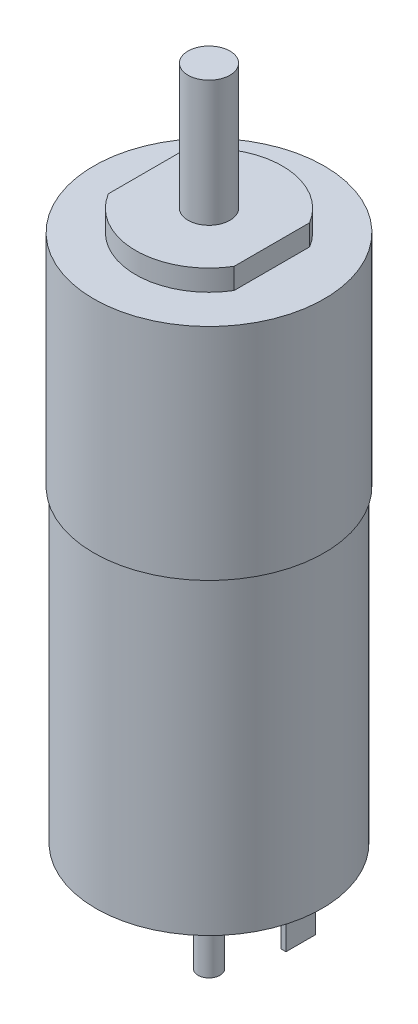
ISO-10303-21;
HEADER;
FILE_DESCRIPTION(('STEP AP214'),'2;1');
FILE_NAME('part.step','',(''),(''),'','','');
FILE_SCHEMA(('AUTOMOTIVE_DESIGN { 1 0 10303 214 1 1 1 1 }'));
ENDSEC;
DATA;
#1=APPLICATION_CONTEXT('core data for automotive mechanical design processes');
#2=APPLICATION_PROTOCOL_DEFINITION('international standard','automotive_design',2000,#1);
#3=PRODUCT_CONTEXT('',#1,'mechanical');
#4=PRODUCT('Part','Part','',(#3));
#5=PRODUCT_RELATED_PRODUCT_CATEGORY('part','',(#4));
#6=PRODUCT_DEFINITION_FORMATION('','',#4);
#7=PRODUCT_DEFINITION_CONTEXT('part definition',#1,'design');
#8=PRODUCT_DEFINITION('design','',#6,#7);
#9=PRODUCT_DEFINITION_SHAPE('','',#8);
#10=(LENGTH_UNIT() NAMED_UNIT(*) SI_UNIT(.MILLI.,.METRE.));
#11=(NAMED_UNIT(*) PLANE_ANGLE_UNIT() SI_UNIT($,.RADIAN.));
#12=(NAMED_UNIT(*) SI_UNIT($,.STERADIAN.) SOLID_ANGLE_UNIT());
#13=UNCERTAINTY_MEASURE_WITH_UNIT(LENGTH_MEASURE(1.E-05),#10,'distance_accuracy_value','');
#14=(GEOMETRIC_REPRESENTATION_CONTEXT(3) GLOBAL_UNCERTAINTY_ASSIGNED_CONTEXT((#13)) GLOBAL_UNIT_ASSIGNED_CONTEXT((#10,
#11,#12)) REPRESENTATION_CONTEXT('',''));
#15=CARTESIAN_POINT('',(0.,0.,0.));
#16=DIRECTION('',(0.,0.,1.));
#17=DIRECTION('',(1.,0.,0.));
#18=AXIS2_PLACEMENT_3D('',#15,#16,#17);
#19=CARTESIAN_POINT('',(0.,0.,0.));
#20=DIRECTION('',(0.,1.,0.));
#21=DIRECTION('',(0.,0.,1.));
#22=AXIS2_PLACEMENT_3D('',#19,#20,#21);
#23=PLANE('',#22);
#24=DIRECTION('',(0.,0.,-1.));
#25=VECTOR('',#24,1.);
#26=CARTESIAN_POINT('',(-8.75,0.,1.4));
#27=LINE('',#26,#25);
#28=CARTESIAN_POINT('',(-8.75,0.,1.4));
#29=VERTEX_POINT('',#28);
#30=CARTESIAN_POINT('',(-8.75,0.,-1.4));
#31=VERTEX_POINT('',#30);
#32=EDGE_CURVE('E155',#29,#31,#27,.T.);
#33=ORIENTED_EDGE('',*,*,#32,.F.);
#34=DIRECTION('',(-1.,0.,0.));
#35=VECTOR('',#34,1.);
#36=CARTESIAN_POINT('',(-8.75,0.,1.4));
#37=LINE('',#36,#35);
#38=CARTESIAN_POINT('',(-8.25,0.,1.4));
#39=VERTEX_POINT('',#38);
#40=EDGE_CURVE('E171',#39,#29,#37,.T.);
#41=ORIENTED_EDGE('',*,*,#40,.F.);
#42=DIRECTION('',(0.,0.,1.));
#43=VECTOR('',#42,1.);
#44=CARTESIAN_POINT('',(-8.25,0.,1.4));
#45=LINE('',#44,#43);
#46=CARTESIAN_POINT('',(-8.25,0.,-1.4));
#47=VERTEX_POINT('',#46);
#48=EDGE_CURVE('E184',#47,#39,#45,.T.);
#49=ORIENTED_EDGE('',*,*,#48,.F.);
#50=DIRECTION('',(1.,0.,0.));
#51=VECTOR('',#50,1.);
#52=CARTESIAN_POINT('',(-8.75,0.,-1.4));
#53=LINE('',#52,#51);
#54=EDGE_CURVE('E160',#31,#47,#53,.T.);
#55=ORIENTED_EDGE('',*,*,#54,.F.);
#56=EDGE_LOOP('',(#33,#41,#49,#55));
#57=FACE_BOUND('',#56,.T.);
#58=CARTESIAN_POINT('',(0.,0.,0.));
#59=DIRECTION('',(0.,-1.,0.));
#60=DIRECTION('',(0.,0.,-1.));
#61=AXIS2_PLACEMENT_3D('',#58,#59,#60);
#62=CIRCLE('',#61,3.75);
#63=CARTESIAN_POINT('',(0.,0.,-3.75));
#64=VERTEX_POINT('',#63);
#65=EDGE_CURVE('E49',#64,#64,#62,.T.);
#66=ORIENTED_EDGE('',*,*,#65,.F.);
#67=EDGE_LOOP('',(#66));
#68=FACE_BOUND('',#67,.T.);
#69=CARTESIAN_POINT('',(0.,0.,0.));
#70=DIRECTION('',(0.,1.,0.));
#71=DIRECTION('',(0.,0.,1.));
#72=AXIS2_PLACEMENT_3D('',#69,#70,#71);
#73=CIRCLE('',#72,10.8);
#74=CARTESIAN_POINT('',(0.,0.,10.8));
#75=VERTEX_POINT('',#74);
#76=EDGE_CURVE('E43',#75,#75,#73,.T.);
#77=ORIENTED_EDGE('',*,*,#76,.F.);
#78=EDGE_LOOP('',(#77));
#79=FACE_BOUND('',#78,.T.);
#80=DIRECTION('',(0.,0.,-1.));
#81=VECTOR('',#80,1.);
#82=CARTESIAN_POINT('',(8.25,0.,1.4));
#83=LINE('',#82,#81);
#84=CARTESIAN_POINT('',(8.25,0.,1.4));
#85=VERTEX_POINT('',#84);
#86=CARTESIAN_POINT('',(8.25,0.,-1.4));
#87=VERTEX_POINT('',#86);
#88=EDGE_CURVE('E153',#85,#87,#83,.T.);
#89=ORIENTED_EDGE('',*,*,#88,.F.);
#90=DIRECTION('',(-1.,0.,0.));
#91=VECTOR('',#90,1.);
#92=CARTESIAN_POINT('',(8.25,0.,1.4));
#93=LINE('',#92,#91);
#94=CARTESIAN_POINT('',(8.75,0.,1.4));
#95=VERTEX_POINT('',#94);
#96=EDGE_CURVE('E150',#95,#85,#93,.T.);
#97=ORIENTED_EDGE('',*,*,#96,.F.);
#98=DIRECTION('',(0.,0.,1.));
#99=VECTOR('',#98,1.);
#100=CARTESIAN_POINT('',(8.75,0.,1.4));
#101=LINE('',#100,#99);
#102=CARTESIAN_POINT('',(8.75,0.,-1.4));
#103=VERTEX_POINT('',#102);
#104=EDGE_CURVE('E62',#103,#95,#101,.T.);
#105=ORIENTED_EDGE('',*,*,#104,.F.);
#106=DIRECTION('',(1.,0.,0.));
#107=VECTOR('',#106,1.);
#108=CARTESIAN_POINT('',(8.25,0.,-1.4));
#109=LINE('',#108,#107);
#110=EDGE_CURVE('E57',#87,#103,#109,.T.);
#111=ORIENTED_EDGE('',*,*,#110,.F.);
#112=EDGE_LOOP('',(#89,#97,#105,#111));
#113=FACE_BOUND('',#112,.T.);
#114=ADVANCED_FACE('F39',(#57,#68,#79,#113),#23,.F.);
#115=CARTESIAN_POINT('',(0.,29.5,0.));
#116=DIRECTION('',(0.,-1.,0.));
#117=DIRECTION('',(0.,0.,-1.));
#118=AXIS2_PLACEMENT_3D('',#115,#116,#117);
#119=CYLINDRICAL_SURFACE('',#118,10.8);
#120=CARTESIAN_POINT('',(0.,29.5,0.));
#121=DIRECTION('',(0.,1.,0.));
#122=DIRECTION('',(0.,0.,1.));
#123=AXIS2_PLACEMENT_3D('',#120,#121,#122);
#124=CIRCLE('',#123,10.8);
#125=CARTESIAN_POINT('',(0.,29.5,10.8));
#126=VERTEX_POINT('',#125);
#127=EDGE_CURVE('E222',#126,#126,#124,.T.);
#128=ORIENTED_EDGE('',*,*,#127,.F.);
#129=EDGE_LOOP('',(#128));
#130=FACE_BOUND('',#129,.T.);
#131=ORIENTED_EDGE('',*,*,#76,.T.);
#132=EDGE_LOOP('',(#131));
#133=FACE_BOUND('',#132,.T.);
#134=ADVANCED_FACE('F41',(#130,#133),#119,.T.);
#135=CARTESIAN_POINT('',(0.,50.5,0.));
#136=DIRECTION('',(0.,-1.,0.));
#137=DIRECTION('',(0.,0.,-1.));
#138=AXIS2_PLACEMENT_3D('',#135,#136,#137);
#139=CYLINDRICAL_SURFACE('',#138,11.);
#140=CARTESIAN_POINT('',(0.,50.5,0.));
#141=DIRECTION('',(0.,1.,0.));
#142=DIRECTION('',(0.,0.,1.));
#143=AXIS2_PLACEMENT_3D('',#140,#141,#142);
#144=CIRCLE('',#143,11.);
#145=CARTESIAN_POINT('',(0.,50.5,-11.));
#146=VERTEX_POINT('',#145);
#147=EDGE_CURVE('E268',#146,#146,#144,.T.);
#148=CARTESIAN_POINT('',(0.,29.5,0.));
#149=DIRECTION('',(0.,1.,0.));
#150=DIRECTION('',(0.,0.,1.));
#151=AXIS2_PLACEMENT_3D('',#148,#149,#150);
#152=CIRCLE('',#151,11.);
#153=CARTESIAN_POINT('',(0.,29.5,-11.));
#154=VERTEX_POINT('',#153);
#155=EDGE_CURVE('E267',#154,#154,#152,.T.);
#156=CARTESIAN_POINT('',(0.,50.5,-11.));
#157=CARTESIAN_POINT('',(0.,50.28125,-11.));
#158=CARTESIAN_POINT('',(0.,50.0625,-11.));
#159=CARTESIAN_POINT('',(0.,49.625,-11.));
#160=CARTESIAN_POINT('',(0.,49.40625,-11.));
#161=CARTESIAN_POINT('',(0.,48.96875,-11.));
#162=CARTESIAN_POINT('',(0.,48.75,-11.));
#163=CARTESIAN_POINT('',(0.,48.3125,-11.));
#164=CARTESIAN_POINT('',(0.,48.09375,-11.));
#165=CARTESIAN_POINT('',(0.,47.65625,-11.));
#166=CARTESIAN_POINT('',(0.,47.4375,-11.));
#167=CARTESIAN_POINT('',(0.,47.,-11.));
#168=CARTESIAN_POINT('',(0.,46.78125,-11.));
#169=CARTESIAN_POINT('',(0.,46.34375,-11.));
#170=CARTESIAN_POINT('',(0.,46.125,-11.));
#171=CARTESIAN_POINT('',(0.,45.6875,-11.));
#172=CARTESIAN_POINT('',(0.,45.46875,-11.));
#173=CARTESIAN_POINT('',(0.,45.03125,-11.));
#174=CARTESIAN_POINT('',(0.,44.8125,-11.));
#175=CARTESIAN_POINT('',(0.,44.375,-11.));
#176=CARTESIAN_POINT('',(0.,44.15625,-11.));
#177=CARTESIAN_POINT('',(0.,43.71875,-11.));
#178=CARTESIAN_POINT('',(0.,43.5,-11.));
#179=CARTESIAN_POINT('',(0.,43.0625,-11.));
#180=CARTESIAN_POINT('',(0.,42.84375,-11.));
#181=CARTESIAN_POINT('',(0.,42.40625,-11.));
#182=CARTESIAN_POINT('',(0.,42.1875,-11.));
#183=CARTESIAN_POINT('',(0.,41.75,-11.));
#184=CARTESIAN_POINT('',(0.,41.53125,-11.));
#185=CARTESIAN_POINT('',(0.,41.09375,-11.));
#186=CARTESIAN_POINT('',(0.,40.875,-11.));
#187=CARTESIAN_POINT('',(0.,40.4375,-11.));
#188=CARTESIAN_POINT('',(0.,40.21875,-11.));
#189=CARTESIAN_POINT('',(0.,39.78125,-11.));
#190=CARTESIAN_POINT('',(0.,39.5625,-11.));
#191=CARTESIAN_POINT('',(0.,39.125,-11.));
#192=CARTESIAN_POINT('',(0.,38.90625,-11.));
#193=CARTESIAN_POINT('',(0.,38.46875,-11.));
#194=CARTESIAN_POINT('',(0.,38.25,-11.));
#195=CARTESIAN_POINT('',(0.,37.8125,-11.));
#196=CARTESIAN_POINT('',(0.,37.59375,-11.));
#197=CARTESIAN_POINT('',(0.,37.15625,-11.));
#198=CARTESIAN_POINT('',(0.,36.9375,-11.));
#199=CARTESIAN_POINT('',(0.,36.5,-11.));
#200=CARTESIAN_POINT('',(0.,36.28125,-11.));
#201=CARTESIAN_POINT('',(0.,35.84375,-11.));
#202=CARTESIAN_POINT('',(0.,35.625,-11.));
#203=CARTESIAN_POINT('',(0.,35.1875,-11.));
#204=CARTESIAN_POINT('',(0.,34.96875,-11.));
#205=CARTESIAN_POINT('',(0.,34.53125,-11.));
#206=CARTESIAN_POINT('',(0.,34.3125,-11.));
#207=CARTESIAN_POINT('',(0.,33.875,-11.));
#208=CARTESIAN_POINT('',(0.,33.65625,-11.));
#209=CARTESIAN_POINT('',(0.,33.21875,-11.));
#210=CARTESIAN_POINT('',(0.,33.,-11.));
#211=CARTESIAN_POINT('',(0.,32.5625,-11.));
#212=CARTESIAN_POINT('',(0.,32.34375,-11.));
#213=CARTESIAN_POINT('',(0.,31.90625,-11.));
#214=CARTESIAN_POINT('',(0.,31.6875,-11.));
#215=CARTESIAN_POINT('',(0.,31.25,-11.));
#216=CARTESIAN_POINT('',(0.,31.03125,-11.));
#217=CARTESIAN_POINT('',(0.,30.59375,-11.));
#218=CARTESIAN_POINT('',(0.,30.375,-11.));
#219=CARTESIAN_POINT('',(0.,29.9375,-11.));
#220=CARTESIAN_POINT('',(0.,29.71875,-11.));
#221=CARTESIAN_POINT('',(0.,29.5,-11.));
#222=B_SPLINE_CURVE_WITH_KNOTS('',3,(#156,#157,#158,#159,#160,#161,#162,#163,#164,#165,#166,
#167,#168,#169,#170,#171,#172,#173,#174,#175,#176,#177,#178,#179,#180,#181,#182,#183,#184,#185,
#186,#187,#188,#189,#190,#191,#192,#193,#194,#195,#196,#197,#198,#199,#200,#201,#202,#203,#204,
#205,#206,#207,#208,#209,#210,#211,#212,#213,#214,#215,#216,#217,#218,#219,#220,#221),
.UNSPECIFIED.,.F.,.F.,(4,2,2,2,2,2,2,2,2,2,2,2,2,2,2,2,2,2,2,2,2,2,2,2,2,2,2,2,2,2,2,2,4),(0.,
0.656249999999997,1.31249999999999,1.96875,2.625,3.28125,3.9375,4.59375,5.25,5.90624999999999,
6.5625,7.21875,7.875,8.53125,9.18749999999999,9.84375,10.5,11.15625,11.8125,12.46875,13.125,
13.78125,14.4375,15.09375,15.75,16.40625,17.0625,17.71875,18.375,19.03125,19.6875,20.34375,21.),.UNSPECIFIED.);
#223=EDGE_CURVE('BSEAM369',#146,#154,#222,.T.);
#224=ORIENTED_EDGE('',*,*,#147,.F.);
#225=ORIENTED_EDGE('',*,*,#155,.T.);
#226=ORIENTED_EDGE('',*,*,#223,.T.);
#227=ORIENTED_EDGE('',*,*,#223,.F.);
#228=EDGE_LOOP('',(#224,#226,#225,#227));
#229=FACE_BOUND('',#228,.T.);
#230=ADVANCED_FACE('F369',(#229),#139,.T.);
#231=CARTESIAN_POINT('',(0.,50.5,0.));
#232=DIRECTION('',(0.,1.,0.));
#233=DIRECTION('',(0.,0.,1.));
#234=AXIS2_PLACEMENT_3D('',#231,#232,#233);
#235=PLANE('',#234);
#236=CARTESIAN_POINT('',(0.,50.5,0.));
#237=DIRECTION('',(0.,1.,0.));
#238=DIRECTION('',(0.,0.,1.));
#239=AXIS2_PLACEMENT_3D('',#236,#237,#238);
#240=CIRCLE('',#239,7.);
#241=CARTESIAN_POINT('',(6.,50.5,-3.60555127546399));
#242=VERTEX_POINT('',#241);
#243=CARTESIAN_POINT('',(-6.,50.5,-3.60555127546399));
#244=VERTEX_POINT('',#243);
#245=EDGE_CURVE('E218',#242,#244,#240,.T.);
#246=ORIENTED_EDGE('',*,*,#245,.F.);
#247=DIRECTION('',(0.,0.,-1.));
#248=VECTOR('',#247,1.);
#249=CARTESIAN_POINT('',(6.,50.5,-3.60555127546399));
#250=LINE('',#249,#248);
#251=CARTESIAN_POINT('',(6.,50.5,3.60555127546399));
#252=VERTEX_POINT('',#251);
#253=EDGE_CURVE('E228',#252,#242,#250,.T.);
#254=ORIENTED_EDGE('',*,*,#253,.F.);
#255=CARTESIAN_POINT('',(0.,50.5,0.));
#256=DIRECTION('',(0.,1.,0.));
#257=DIRECTION('',(0.,0.,1.));
#258=AXIS2_PLACEMENT_3D('',#255,#256,#257);
#259=CIRCLE('',#258,7.);
#260=CARTESIAN_POINT('',(-6.,50.5,3.60555127546399));
#261=VERTEX_POINT('',#260);
#262=EDGE_CURVE('E245',#261,#252,#259,.T.);
#263=ORIENTED_EDGE('',*,*,#262,.F.);
#264=DIRECTION('',(0.,0.,1.));
#265=VECTOR('',#264,1.);
#266=CARTESIAN_POINT('',(-6.,50.5,-3.60555127546399));
#267=LINE('',#266,#265);
#268=EDGE_CURVE('E241',#244,#261,#267,.T.);
#269=ORIENTED_EDGE('',*,*,#268,.F.);
#270=EDGE_LOOP('',(#246,#254,#263,#269));
#271=FACE_BOUND('',#270,.T.);
#272=ORIENTED_EDGE('',*,*,#147,.T.);
#273=EDGE_LOOP('',(#272));
#274=FACE_BOUND('',#273,.T.);
#275=ADVANCED_FACE('F366',(#271,#274),#235,.T.);
#276=CARTESIAN_POINT('',(0.,29.5,0.));
#277=DIRECTION('',(0.,1.,0.));
#278=DIRECTION('',(0.,0.,1.));
#279=AXIS2_PLACEMENT_3D('',#276,#277,#278);
#280=PLANE('',#279);
#281=ORIENTED_EDGE('',*,*,#127,.T.);
#282=EDGE_LOOP('',(#281));
#283=FACE_BOUND('',#282,.T.);
#284=ORIENTED_EDGE('',*,*,#155,.F.);
#285=EDGE_LOOP('',(#284));
#286=FACE_BOUND('',#285,.T.);
#287=ADVANCED_FACE('F364',(#283,#286),#280,.F.);
#288=CARTESIAN_POINT('',(0.,52.5,0.));
#289=DIRECTION('',(0.,-1.,0.));
#290=DIRECTION('',(0.,0.,-1.));
#291=AXIS2_PLACEMENT_3D('',#288,#289,#290);
#292=CYLINDRICAL_SURFACE('',#291,7.);
#293=ORIENTED_EDGE('',*,*,#245,.T.);
#294=DIRECTION('',(0.,-1.,0.));
#295=VECTOR('',#294,1.);
#296=CARTESIAN_POINT('',(-6.,52.5,-3.60555127546399));
#297=LINE('',#296,#295);
#298=CARTESIAN_POINT('',(-6.,52.5,-3.60555127546399));
#299=VERTEX_POINT('',#298);
#300=EDGE_CURVE('E263',#299,#244,#297,.T.);
#301=ORIENTED_EDGE('',*,*,#300,.F.);
#302=CARTESIAN_POINT('',(0.,52.5,0.));
#303=DIRECTION('',(0.,1.,0.));
#304=DIRECTION('',(0.,0.,1.));
#305=AXIS2_PLACEMENT_3D('',#302,#303,#304);
#306=CIRCLE('',#305,7.);
#307=CARTESIAN_POINT('',(6.,52.5,-3.60555127546399));
#308=VERTEX_POINT('',#307);
#309=EDGE_CURVE('E223',#308,#299,#306,.T.);
#310=ORIENTED_EDGE('',*,*,#309,.F.);
#311=DIRECTION('',(0.,-1.,0.));
#312=VECTOR('',#311,1.);
#313=CARTESIAN_POINT('',(6.,52.5,-3.60555127546399));
#314=LINE('',#313,#312);
#315=EDGE_CURVE('E237',#308,#242,#314,.T.);
#316=ORIENTED_EDGE('',*,*,#315,.T.);
#317=EDGE_LOOP('',(#293,#301,#310,#316));
#318=FACE_BOUND('',#317,.T.);
#319=ADVANCED_FACE('F360',(#318),#292,.T.);
#320=CARTESIAN_POINT('',(-6.,52.5,-3.60555127546399));
#321=DIRECTION('',(1.,0.,0.));
#322=DIRECTION('',(0.,0.,-1.));
#323=AXIS2_PLACEMENT_3D('',#320,#321,#322);
#324=PLANE('',#323);
#325=ORIENTED_EDGE('',*,*,#268,.T.);
#326=DIRECTION('',(0.,-1.,0.));
#327=VECTOR('',#326,1.);
#328=CARTESIAN_POINT('',(-6.,52.5,3.60555127546399));
#329=LINE('',#328,#327);
#330=CARTESIAN_POINT('',(-6.,52.5,3.60555127546399));
#331=VERTEX_POINT('',#330);
#332=EDGE_CURVE('E259',#331,#261,#329,.T.);
#333=ORIENTED_EDGE('',*,*,#332,.F.);
#334=DIRECTION('',(0.,0.,1.));
#335=VECTOR('',#334,1.);
#336=CARTESIAN_POINT('',(-6.,52.5,-3.60555127546399));
#337=LINE('',#336,#335);
#338=EDGE_CURVE('E227',#299,#331,#337,.T.);
#339=ORIENTED_EDGE('',*,*,#338,.F.);
#340=ORIENTED_EDGE('',*,*,#300,.T.);
#341=EDGE_LOOP('',(#325,#333,#339,#340));
#342=FACE_BOUND('',#341,.T.);
#343=ADVANCED_FACE('F356',(#342),#324,.F.);
#344=CARTESIAN_POINT('',(0.,52.5,0.));
#345=DIRECTION('',(0.,-1.,0.));
#346=DIRECTION('',(0.,0.,-1.));
#347=AXIS2_PLACEMENT_3D('',#344,#345,#346);
#348=CYLINDRICAL_SURFACE('',#347,7.);
#349=ORIENTED_EDGE('',*,*,#262,.T.);
#350=DIRECTION('',(0.,-1.,0.));
#351=VECTOR('',#350,1.);
#352=CARTESIAN_POINT('',(6.,52.5,3.60555127546399));
#353=LINE('',#352,#351);
#354=CARTESIAN_POINT('',(6.,52.5,3.60555127546399));
#355=VERTEX_POINT('',#354);
#356=EDGE_CURVE('E255',#355,#252,#353,.T.);
#357=ORIENTED_EDGE('',*,*,#356,.F.);
#358=CARTESIAN_POINT('',(0.,52.5,0.));
#359=DIRECTION('',(0.,1.,0.));
#360=DIRECTION('',(0.,0.,1.));
#361=AXIS2_PLACEMENT_3D('',#358,#359,#360);
#362=CIRCLE('',#361,7.);
#363=EDGE_CURVE('E231',#331,#355,#362,.T.);
#364=ORIENTED_EDGE('',*,*,#363,.F.);
#365=ORIENTED_EDGE('',*,*,#332,.T.);
#366=EDGE_LOOP('',(#349,#357,#364,#365));
#367=FACE_BOUND('',#366,.T.);
#368=ADVANCED_FACE('F352',(#367),#348,.T.);
#369=CARTESIAN_POINT('',(6.,52.5,-3.60555127546399));
#370=DIRECTION('',(-1.,0.,0.));
#371=DIRECTION('',(0.,0.,1.));
#372=AXIS2_PLACEMENT_3D('',#369,#370,#371);
#373=PLANE('',#372);
#374=ORIENTED_EDGE('',*,*,#253,.T.);
#375=ORIENTED_EDGE('',*,*,#315,.F.);
#376=DIRECTION('',(0.,0.,-1.));
#377=VECTOR('',#376,1.);
#378=CARTESIAN_POINT('',(6.,52.5,-3.60555127546399));
#379=LINE('',#378,#377);
#380=EDGE_CURVE('E234',#355,#308,#379,.T.);
#381=ORIENTED_EDGE('',*,*,#380,.F.);
#382=ORIENTED_EDGE('',*,*,#356,.T.);
#383=EDGE_LOOP('',(#374,#375,#381,#382));
#384=FACE_BOUND('',#383,.T.);
#385=ADVANCED_FACE('F348',(#384),#373,.F.);
#386=CARTESIAN_POINT('',(0.,52.5,0.));
#387=DIRECTION('',(0.,1.,0.));
#388=DIRECTION('',(0.,0.,1.));
#389=AXIS2_PLACEMENT_3D('',#386,#387,#388);
#390=PLANE('',#389);
#391=CARTESIAN_POINT('',(0.,52.5,0.));
#392=DIRECTION('',(0.,1.,0.));
#393=DIRECTION('',(0.,0.,1.));
#394=AXIS2_PLACEMENT_3D('',#391,#392,#393);
#395=CIRCLE('',#394,2.);
#396=CARTESIAN_POINT('',(0.,52.5,2.));
#397=VERTEX_POINT('',#396);
#398=EDGE_CURVE('E214',#397,#397,#395,.T.);
#399=ORIENTED_EDGE('',*,*,#398,.F.);
#400=EDGE_LOOP('',(#399));
#401=FACE_BOUND('',#400,.T.);
#402=ORIENTED_EDGE('',*,*,#309,.T.);
#403=ORIENTED_EDGE('',*,*,#338,.T.);
#404=ORIENTED_EDGE('',*,*,#363,.T.);
#405=ORIENTED_EDGE('',*,*,#380,.T.);
#406=EDGE_LOOP('',(#402,#403,#404,#405));
#407=FACE_BOUND('',#406,.T.);
#408=ADVANCED_FACE('F344',(#401,#407),#390,.T.);
#409=CARTESIAN_POINT('',(0.,64.5,0.));
#410=DIRECTION('',(0.,-1.,0.));
#411=DIRECTION('',(0.,0.,-1.));
#412=AXIS2_PLACEMENT_3D('',#409,#410,#411);
#413=CYLINDRICAL_SURFACE('',#412,2.);
#414=CARTESIAN_POINT('',(0.,64.5,0.));
#415=DIRECTION('',(0.,1.,0.));
#416=DIRECTION('',(0.,0.,1.));
#417=AXIS2_PLACEMENT_3D('',#414,#415,#416);
#418=CIRCLE('',#417,2.);
#419=CARTESIAN_POINT('',(0.,64.5,2.));
#420=VERTEX_POINT('',#419);
#421=EDGE_CURVE('E210',#420,#420,#418,.T.);
#422=ORIENTED_EDGE('',*,*,#421,.F.);
#423=EDGE_LOOP('',(#422));
#424=FACE_BOUND('',#423,.T.);
#425=ORIENTED_EDGE('',*,*,#398,.T.);
#426=EDGE_LOOP('',(#425));
#427=FACE_BOUND('',#426,.T.);
#428=ADVANCED_FACE('F337',(#424,#427),#413,.T.);
#429=CARTESIAN_POINT('',(0.,64.5,0.));
#430=DIRECTION('',(0.,1.,0.));
#431=DIRECTION('',(0.,0.,1.));
#432=AXIS2_PLACEMENT_3D('',#429,#430,#431);
#433=PLANE('',#432);
#434=ORIENTED_EDGE('',*,*,#421,.T.);
#435=EDGE_LOOP('',(#434));
#436=FACE_BOUND('',#435,.T.);
#437=ADVANCED_FACE('F330',(#436),#433,.T.);
#438=CARTESIAN_POINT('',(0.,-2.,0.));
#439=DIRECTION('',(0.,1.,0.));
#440=DIRECTION('',(0.,0.,1.));
#441=AXIS2_PLACEMENT_3D('',#438,#439,#440);
#442=CYLINDRICAL_SURFACE('',#441,3.75);
#443=CARTESIAN_POINT('',(0.,-2.,0.));
#444=DIRECTION('',(0.,-1.,0.));
#445=DIRECTION('',(0.,0.,-1.));
#446=AXIS2_PLACEMENT_3D('',#443,#444,#445);
#447=CIRCLE('',#446,3.75);
#448=CARTESIAN_POINT('',(0.,-2.,-3.75));
#449=VERTEX_POINT('',#448);
#450=EDGE_CURVE('E206',#449,#449,#447,.T.);
#451=ORIENTED_EDGE('',*,*,#450,.F.);
#452=EDGE_LOOP('',(#451));
#453=FACE_BOUND('',#452,.T.);
#454=ORIENTED_EDGE('',*,*,#65,.T.);
#455=EDGE_LOOP('',(#454));
#456=FACE_BOUND('',#455,.T.);
#457=ADVANCED_FACE('F324',(#453,#456),#442,.T.);
#458=CARTESIAN_POINT('',(0.,-2.,0.));
#459=DIRECTION('',(0.,-1.,0.));
#460=DIRECTION('',(0.,0.,-1.));
#461=AXIS2_PLACEMENT_3D('',#458,#459,#460);
#462=PLANE('',#461);
#463=CARTESIAN_POINT('',(0.,-2.,0.));
#464=DIRECTION('',(0.,-1.,0.));
#465=DIRECTION('',(0.,0.,-1.));
#466=AXIS2_PLACEMENT_3D('',#463,#464,#465);
#467=CIRCLE('',#466,1.05);
#468=CARTESIAN_POINT('',(0.,-2.,-1.05));
#469=VERTEX_POINT('',#468);
#470=EDGE_CURVE('E11',#469,#469,#467,.T.);
#471=ORIENTED_EDGE('',*,*,#470,.F.);
#472=EDGE_LOOP('',(#471));
#473=FACE_BOUND('',#472,.T.);
#474=ORIENTED_EDGE('',*,*,#450,.T.);
#475=EDGE_LOOP('',(#474));
#476=FACE_BOUND('',#475,.T.);
#477=ADVANCED_FACE('F320',(#473,#476),#462,.T.);
#478=CARTESIAN_POINT('',(-8.75,-3.9,1.4));
#479=DIRECTION('',(1.,0.,0.));
#480=DIRECTION('',(0.,0.,-1.));
#481=AXIS2_PLACEMENT_3D('',#478,#479,#480);
#482=PLANE('',#481);
#483=ORIENTED_EDGE('',*,*,#32,.T.);
#484=DIRECTION('',(0.,1.,0.));
#485=VECTOR('',#484,1.);
#486=CARTESIAN_POINT('',(-8.75,-3.9,-1.4));
#487=LINE('',#486,#485);
#488=CARTESIAN_POINT('',(-8.75,-3.9,-1.4));
#489=VERTEX_POINT('',#488);
#490=EDGE_CURVE('E202',#489,#31,#487,.T.);
#491=ORIENTED_EDGE('',*,*,#490,.F.);
#492=DIRECTION('',(0.,0.,-1.));
#493=VECTOR('',#492,1.);
#494=CARTESIAN_POINT('',(-8.75,-3.9,1.4));
#495=LINE('',#494,#493);
#496=CARTESIAN_POINT('',(-8.75,-3.9,1.4));
#497=VERTEX_POINT('',#496);
#498=EDGE_CURVE('E166',#497,#489,#495,.T.);
#499=ORIENTED_EDGE('',*,*,#498,.F.);
#500=DIRECTION('',(0.,1.,0.));
#501=VECTOR('',#500,1.);
#502=CARTESIAN_POINT('',(-8.75,-3.9,1.4));
#503=LINE('',#502,#501);
#504=EDGE_CURVE('E179',#497,#29,#503,.T.);
#505=ORIENTED_EDGE('',*,*,#504,.T.);
#506=EDGE_LOOP('',(#483,#491,#499,#505));
#507=FACE_BOUND('',#506,.T.);
#508=ADVANCED_FACE('F323',(#507),#482,.F.);
#509=CARTESIAN_POINT('',(-8.75,-3.9,-1.4));
#510=DIRECTION('',(0.,0.,1.));
#511=DIRECTION('',(1.,0.,0.));
#512=AXIS2_PLACEMENT_3D('',#509,#510,#511);
#513=PLANE('',#512);
#514=ORIENTED_EDGE('',*,*,#54,.T.);
#515=DIRECTION('',(0.,1.,0.));
#516=VECTOR('',#515,1.);
#517=CARTESIAN_POINT('',(-8.25,-3.9,-1.4));
#518=LINE('',#517,#516);
#519=CARTESIAN_POINT('',(-8.25,-3.9,-1.4));
#520=VERTEX_POINT('',#519);
#521=EDGE_CURVE('E198',#520,#47,#518,.T.);
#522=ORIENTED_EDGE('',*,*,#521,.F.);
#523=DIRECTION('',(1.,0.,0.));
#524=VECTOR('',#523,1.);
#525=CARTESIAN_POINT('',(-8.75,-3.9,-1.4));
#526=LINE('',#525,#524);
#527=EDGE_CURVE('E170',#489,#520,#526,.T.);
#528=ORIENTED_EDGE('',*,*,#527,.F.);
#529=ORIENTED_EDGE('',*,*,#490,.T.);
#530=EDGE_LOOP('',(#514,#522,#528,#529));
#531=FACE_BOUND('',#530,.T.);
#532=ADVANCED_FACE('F403',(#531),#513,.F.);
#533=CARTESIAN_POINT('',(-8.25,-3.9,1.4));
#534=DIRECTION('',(-1.,0.,0.));
#535=DIRECTION('',(0.,0.,1.));
#536=AXIS2_PLACEMENT_3D('',#533,#534,#535);
#537=PLANE('',#536);
#538=ORIENTED_EDGE('',*,*,#48,.T.);
#539=DIRECTION('',(0.,1.,0.));
#540=VECTOR('',#539,1.);
#541=CARTESIAN_POINT('',(-8.25,-3.9,1.4));
#542=LINE('',#541,#540);
#543=CARTESIAN_POINT('',(-8.25,-3.9,1.4));
#544=VERTEX_POINT('',#543);
#545=EDGE_CURVE('E194',#544,#39,#542,.T.);
#546=ORIENTED_EDGE('',*,*,#545,.F.);
#547=DIRECTION('',(0.,0.,1.));
#548=VECTOR('',#547,1.);
#549=CARTESIAN_POINT('',(-8.25,-3.9,1.4));
#550=LINE('',#549,#548);
#551=EDGE_CURVE('E174',#520,#544,#550,.T.);
#552=ORIENTED_EDGE('',*,*,#551,.F.);
#553=ORIENTED_EDGE('',*,*,#521,.T.);
#554=EDGE_LOOP('',(#538,#546,#552,#553));
#555=FACE_BOUND('',#554,.T.);
#556=ADVANCED_FACE('F412',(#555),#537,.F.);
#557=CARTESIAN_POINT('',(-8.75,-3.9,1.4));
#558=DIRECTION('',(0.,0.,-1.));
#559=DIRECTION('',(-1.,0.,0.));
#560=AXIS2_PLACEMENT_3D('',#557,#558,#559);
#561=PLANE('',#560);
#562=ORIENTED_EDGE('',*,*,#40,.T.);
#563=ORIENTED_EDGE('',*,*,#504,.F.);
#564=DIRECTION('',(-1.,0.,0.));
#565=VECTOR('',#564,1.);
#566=CARTESIAN_POINT('',(-8.75,-3.9,1.4));
#567=LINE('',#566,#565);
#568=EDGE_CURVE('E177',#544,#497,#567,.T.);
#569=ORIENTED_EDGE('',*,*,#568,.F.);
#570=ORIENTED_EDGE('',*,*,#545,.T.);
#571=EDGE_LOOP('',(#562,#563,#569,#570));
#572=FACE_BOUND('',#571,.T.);
#573=ADVANCED_FACE('F422',(#572),#561,.F.);
#574=CARTESIAN_POINT('',(0.,-3.9,0.));
#575=DIRECTION('',(0.,-1.,0.));
#576=DIRECTION('',(0.,0.,-1.));
#577=AXIS2_PLACEMENT_3D('',#574,#575,#576);
#578=PLANE('',#577);
#579=ORIENTED_EDGE('',*,*,#498,.T.);
#580=ORIENTED_EDGE('',*,*,#527,.T.);
#581=ORIENTED_EDGE('',*,*,#551,.T.);
#582=ORIENTED_EDGE('',*,*,#568,.T.);
#583=EDGE_LOOP('',(#579,#580,#581,#582));
#584=FACE_BOUND('',#583,.T.);
#585=ADVANCED_FACE('F432',(#584),#578,.T.);
#586=CARTESIAN_POINT('',(8.25,-3.9,1.4));
#587=DIRECTION('',(1.,0.,0.));
#588=DIRECTION('',(0.,0.,-1.));
#589=AXIS2_PLACEMENT_3D('',#586,#587,#588);
#590=PLANE('',#589);
#591=ORIENTED_EDGE('',*,*,#88,.T.);
#592=DIRECTION('',(0.,1.,0.));
#593=VECTOR('',#592,1.);
#594=CARTESIAN_POINT('',(8.25,-3.9,-1.4));
#595=LINE('',#594,#593);
#596=CARTESIAN_POINT('',(8.25,-3.9,-1.4));
#597=VERTEX_POINT('',#596);
#598=EDGE_CURVE('E132',#597,#87,#595,.T.);
#599=ORIENTED_EDGE('',*,*,#598,.F.);
#600=DIRECTION('',(0.,0.,-1.));
#601=VECTOR('',#600,1.);
#602=CARTESIAN_POINT('',(8.25,-3.9,1.4));
#603=LINE('',#602,#601);
#604=CARTESIAN_POINT('',(8.25,-3.9,1.4));
#605=VERTEX_POINT('',#604);
#606=EDGE_CURVE('E140',#605,#597,#603,.T.);
#607=ORIENTED_EDGE('',*,*,#606,.F.);
#608=DIRECTION('',(0.,1.,0.));
#609=VECTOR('',#608,1.);
#610=CARTESIAN_POINT('',(8.25,-3.9,1.4));
#611=LINE('',#610,#609);
#612=EDGE_CURVE('E292',#605,#85,#611,.T.);
#613=ORIENTED_EDGE('',*,*,#612,.T.);
#614=EDGE_LOOP('',(#591,#599,#607,#613));
#615=FACE_BOUND('',#614,.T.);
#616=ADVANCED_FACE('F152',(#615),#590,.F.);
#617=CARTESIAN_POINT('',(8.25,-3.9,-1.4));
#618=DIRECTION('',(0.,0.,1.));
#619=DIRECTION('',(1.,0.,0.));
#620=AXIS2_PLACEMENT_3D('',#617,#618,#619);
#621=PLANE('',#620);
#622=ORIENTED_EDGE('',*,*,#110,.T.);
#623=DIRECTION('',(0.,1.,0.));
#624=VECTOR('',#623,1.);
#625=CARTESIAN_POINT('',(8.75,-3.9,-1.4));
#626=LINE('',#625,#624);
#627=CARTESIAN_POINT('',(8.75,-3.9,-1.4));
#628=VERTEX_POINT('',#627);
#629=EDGE_CURVE('E135',#628,#103,#626,.T.);
#630=ORIENTED_EDGE('',*,*,#629,.F.);
#631=DIRECTION('',(1.,0.,0.));
#632=VECTOR('',#631,1.);
#633=CARTESIAN_POINT('',(8.25,-3.9,-1.4));
#634=LINE('',#633,#632);
#635=EDGE_CURVE('E128',#597,#628,#634,.T.);
#636=ORIENTED_EDGE('',*,*,#635,.F.);
#637=ORIENTED_EDGE('',*,*,#598,.T.);
#638=EDGE_LOOP('',(#622,#630,#636,#637));
#639=FACE_BOUND('',#638,.T.);
#640=ADVANCED_FACE('F130',(#639),#621,.F.);
#641=CARTESIAN_POINT('',(8.75,-3.9,1.4));
#642=DIRECTION('',(-1.,0.,0.));
#643=DIRECTION('',(0.,0.,1.));
#644=AXIS2_PLACEMENT_3D('',#641,#642,#643);
#645=PLANE('',#644);
#646=ORIENTED_EDGE('',*,*,#104,.T.);
#647=DIRECTION('',(0.,1.,0.));
#648=VECTOR('',#647,1.);
#649=CARTESIAN_POINT('',(8.75,-3.9,1.4));
#650=LINE('',#649,#648);
#651=CARTESIAN_POINT('',(8.75,-3.9,1.4));
#652=VERTEX_POINT('',#651);
#653=EDGE_CURVE('E162',#652,#95,#650,.T.);
#654=ORIENTED_EDGE('',*,*,#653,.F.);
#655=DIRECTION('',(0.,0.,1.));
#656=VECTOR('',#655,1.);
#657=CARTESIAN_POINT('',(8.75,-3.9,1.4));
#658=LINE('',#657,#656);
#659=EDGE_CURVE('E139',#628,#652,#658,.T.);
#660=ORIENTED_EDGE('',*,*,#659,.F.);
#661=ORIENTED_EDGE('',*,*,#629,.T.);
#662=EDGE_LOOP('',(#646,#654,#660,#661));
#663=FACE_BOUND('',#662,.T.);
#664=ADVANCED_FACE('F459',(#663),#645,.F.);
#665=CARTESIAN_POINT('',(8.25,-3.9,1.4));
#666=DIRECTION('',(0.,0.,-1.));
#667=DIRECTION('',(-1.,0.,0.));
#668=AXIS2_PLACEMENT_3D('',#665,#666,#667);
#669=PLANE('',#668);
#670=ORIENTED_EDGE('',*,*,#96,.T.);
#671=ORIENTED_EDGE('',*,*,#612,.F.);
#672=DIRECTION('',(-1.,0.,0.));
#673=VECTOR('',#672,1.);
#674=CARTESIAN_POINT('',(8.25,-3.9,1.4));
#675=LINE('',#674,#673);
#676=EDGE_CURVE('E145',#652,#605,#675,.T.);
#677=ORIENTED_EDGE('',*,*,#676,.F.);
#678=ORIENTED_EDGE('',*,*,#653,.T.);
#679=EDGE_LOOP('',(#670,#671,#677,#678));
#680=FACE_BOUND('',#679,.T.);
#681=ADVANCED_FACE('F291',(#680),#669,.F.);
#682=CARTESIAN_POINT('',(0.,-3.9,0.));
#683=DIRECTION('',(0.,-1.,0.));
#684=DIRECTION('',(0.,0.,-1.));
#685=AXIS2_PLACEMENT_3D('',#682,#683,#684);
#686=PLANE('',#685);
#687=ORIENTED_EDGE('',*,*,#606,.T.);
#688=ORIENTED_EDGE('',*,*,#635,.T.);
#689=ORIENTED_EDGE('',*,*,#659,.T.);
#690=ORIENTED_EDGE('',*,*,#676,.T.);
#691=EDGE_LOOP('',(#687,#688,#689,#690));
#692=FACE_BOUND('',#691,.T.);
#693=ADVANCED_FACE('F143',(#692),#686,.T.);
#694=CARTESIAN_POINT('',(0.,-10.4,0.));
#695=DIRECTION('',(0.,1.,0.));
#696=DIRECTION('',(0.,0.,1.));
#697=AXIS2_PLACEMENT_3D('',#694,#695,#696);
#698=CYLINDRICAL_SURFACE('',#697,1.05);
#699=CARTESIAN_POINT('',(0.,-10.4,0.));
#700=DIRECTION('',(0.,-1.,0.));
#701=DIRECTION('',(0.,0.,-1.));
#702=AXIS2_PLACEMENT_3D('',#699,#700,#701);
#703=CIRCLE('',#702,1.05);
#704=CARTESIAN_POINT('',(0.,-10.4,-1.05));
#705=VERTEX_POINT('',#704);
#706=EDGE_CURVE('E287',#705,#705,#703,.T.);
#707=ORIENTED_EDGE('',*,*,#706,.F.);
#708=EDGE_LOOP('',(#707));
#709=FACE_BOUND('',#708,.T.);
#710=ORIENTED_EDGE('',*,*,#470,.T.);
#711=EDGE_LOOP('',(#710));
#712=FACE_BOUND('',#711,.T.);
#713=ADVANCED_FACE('F314',(#709,#712),#698,.T.);
#714=CARTESIAN_POINT('',(0.,-10.4,0.));
#715=DIRECTION('',(0.,-1.,0.));
#716=DIRECTION('',(0.,0.,-1.));
#717=AXIS2_PLACEMENT_3D('',#714,#715,#716);
#718=PLANE('',#717);
#719=ORIENTED_EDGE('',*,*,#706,.T.);
#720=EDGE_LOOP('',(#719));
#721=FACE_BOUND('',#720,.T.);
#722=ADVANCED_FACE('F312',(#721),#718,.T.);
#723=CLOSED_SHELL('',(#114,#134,#230,#275,#287,#319,#343,#368,#385,#408,#428,#437,#457,#477,
#508,#532,#556,#573,#585,#616,#640,#664,#681,#693,#713,#722));
#724=MANIFOLD_SOLID_BREP('B2',#723);
#725=ADVANCED_BREP_SHAPE_REPRESENTATION('',(#18,#724),#14);
#726=SHAPE_DEFINITION_REPRESENTATION(#9,#725);
ENDSEC;
END-ISO-10303-21;
